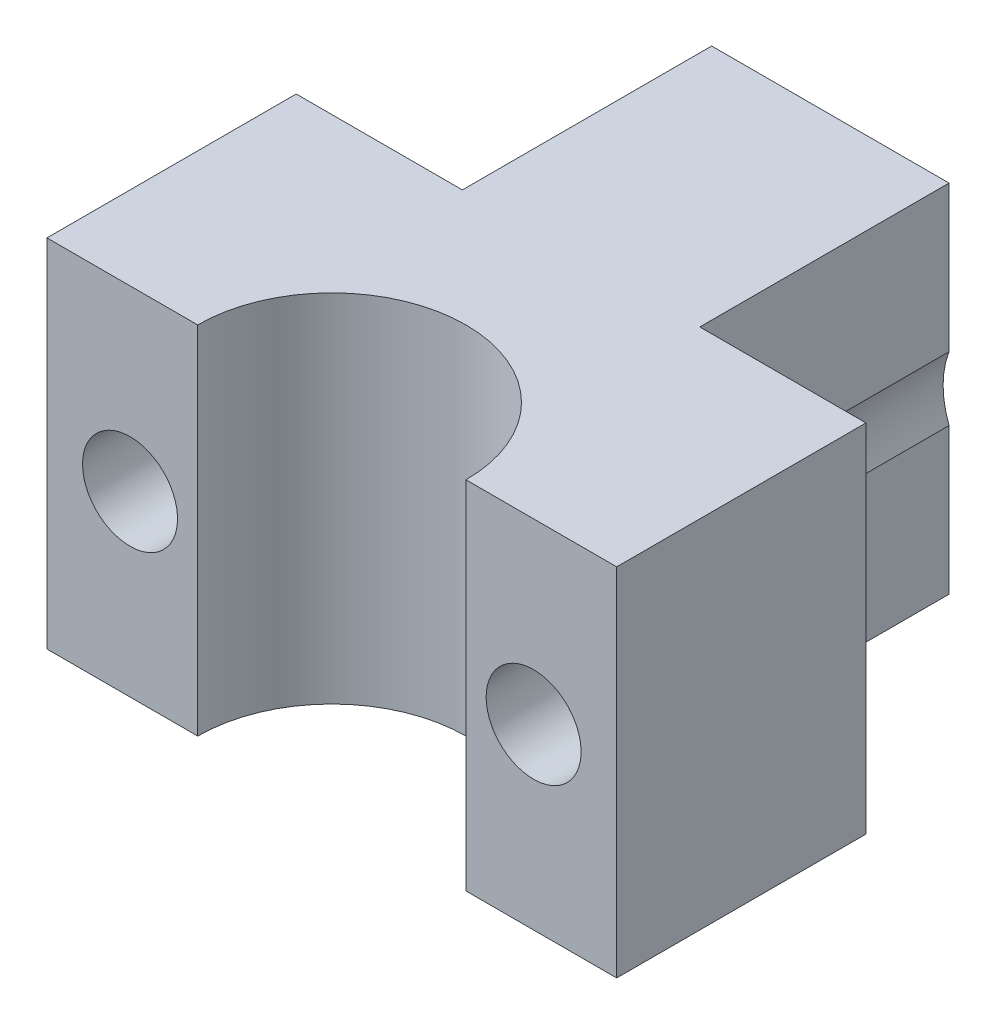
ISO-10303-21;
HEADER;
FILE_DESCRIPTION(('STEP AP214'),'2;1');
FILE_NAME('part.step','',(''),(''),'','','');
FILE_SCHEMA(('AUTOMOTIVE_DESIGN { 1 0 10303 214 1 1 1 1 }'));
ENDSEC;
DATA;
#1=APPLICATION_CONTEXT('core data for automotive mechanical design processes');
#2=APPLICATION_PROTOCOL_DEFINITION('international standard','automotive_design',2000,#1);
#3=PRODUCT_CONTEXT('',#1,'mechanical');
#4=PRODUCT('Part','Part','',(#3));
#5=PRODUCT_RELATED_PRODUCT_CATEGORY('part','',(#4));
#6=PRODUCT_DEFINITION_FORMATION('','',#4);
#7=PRODUCT_DEFINITION_CONTEXT('part definition',#1,'design');
#8=PRODUCT_DEFINITION('design','',#6,#7);
#9=PRODUCT_DEFINITION_SHAPE('','',#8);
#10=(LENGTH_UNIT() NAMED_UNIT(*) SI_UNIT(.MILLI.,.METRE.));
#11=(NAMED_UNIT(*) PLANE_ANGLE_UNIT() SI_UNIT($,.RADIAN.));
#12=(NAMED_UNIT(*) SI_UNIT($,.STERADIAN.) SOLID_ANGLE_UNIT());
#13=UNCERTAINTY_MEASURE_WITH_UNIT(LENGTH_MEASURE(1.E-05),#10,'distance_accuracy_value','');
#14=(GEOMETRIC_REPRESENTATION_CONTEXT(3) GLOBAL_UNCERTAINTY_ASSIGNED_CONTEXT((#13)) GLOBAL_UNIT_ASSIGNED_CONTEXT((#10,
#11,#12)) REPRESENTATION_CONTEXT('',''));
#15=CARTESIAN_POINT('',(0.,0.,0.));
#16=DIRECTION('',(0.,0.,1.));
#17=DIRECTION('',(1.,0.,0.));
#18=AXIS2_PLACEMENT_3D('',#15,#16,#17);
#19=CARTESIAN_POINT('',(-10.,0.,0.));
#20=DIRECTION('',(1.,0.,0.));
#21=DIRECTION('',(0.,0.,-1.));
#22=AXIS2_PLACEMENT_3D('',#19,#20,#21);
#23=PLANE('',#22);
#24=DIRECTION('',(0.,0.,1.));
#25=VECTOR('',#24,1.);
#26=CARTESIAN_POINT('',(-10.,17.6925824035673,-32.));
#27=LINE('',#26,#25);
#28=CARTESIAN_POINT('',(-10.,17.6925824035673,-11.));
#29=VERTEX_POINT('',#28);
#30=CARTESIAN_POINT('',(-10.,17.6925824035673,-16.4));
#31=VERTEX_POINT('',#30);
#32=EDGE_CURVE('E11',#29,#31,#27,.F.);
#33=ORIENTED_EDGE('',*,*,#32,.F.);
#34=DIRECTION('',(0.,1.,0.));
#35=VECTOR('',#34,1.);
#36=CARTESIAN_POINT('',(-10.,0.,-11.));
#37=LINE('',#36,#35);
#38=CARTESIAN_POINT('',(-10.,30.,-11.));
#39=VERTEX_POINT('',#38);
#40=EDGE_CURVE('E355',#29,#39,#37,.T.);
#41=ORIENTED_EDGE('',*,*,#40,.T.);
#42=DIRECTION('',(0.,0.,-1.));
#43=VECTOR('',#42,1.);
#44=CARTESIAN_POINT('',(-10.,30.,-11.));
#45=LINE('',#44,#43);
#46=CARTESIAN_POINT('',(-10.,30.,-32.));
#47=VERTEX_POINT('',#46);
#48=EDGE_CURVE('E246',#39,#47,#45,.T.);
#49=ORIENTED_EDGE('',*,*,#48,.T.);
#50=DIRECTION('',(0.,-1.,0.));
#51=VECTOR('',#50,1.);
#52=CARTESIAN_POINT('',(-10.,0.,-32.));
#53=LINE('',#52,#51);
#54=CARTESIAN_POINT('',(-10.,17.6925824035673,-32.));
#55=VERTEX_POINT('',#54);
#56=EDGE_CURVE('E238',#47,#55,#53,.T.);
#57=ORIENTED_EDGE('',*,*,#56,.T.);
#58=CARTESIAN_POINT('',(-10.,17.6925824035673,-26.6));
#59=VERTEX_POINT('',#58);
#60=EDGE_CURVE('E41',#59,#55,#27,.F.);
#61=ORIENTED_EDGE('',*,*,#60,.F.);
#62=DIRECTION('',(0.,-1.,0.));
#63=VECTOR('',#62,1.);
#64=CARTESIAN_POINT('',(-10.,4.9,-26.6));
#65=LINE('',#64,#63);
#66=CARTESIAN_POINT('',(-10.,25.1,-26.6));
#67=VERTEX_POINT('',#66);
#68=EDGE_CURVE('E343',#67,#59,#65,.T.);
#69=ORIENTED_EDGE('',*,*,#68,.F.);
#70=DIRECTION('',(0.,0.,-1.));
#71=VECTOR('',#70,1.);
#72=CARTESIAN_POINT('',(-10.,25.1,-16.4));
#73=LINE('',#72,#71);
#74=CARTESIAN_POINT('',(-10.,25.1,-16.4));
#75=VERTEX_POINT('',#74);
#76=EDGE_CURVE('E339',#75,#67,#73,.T.);
#77=ORIENTED_EDGE('',*,*,#76,.F.);
#78=DIRECTION('',(0.,1.,0.));
#79=VECTOR('',#78,1.);
#80=CARTESIAN_POINT('',(-10.,4.9,-16.4));
#81=LINE('',#80,#79);
#82=EDGE_CURVE('E335',#31,#75,#81,.T.);
#83=ORIENTED_EDGE('',*,*,#82,.F.);
#84=EDGE_LOOP('',(#33,#41,#49,#57,#61,#69,#77,#83));
#85=FACE_BOUND('',#84,.T.);
#86=ADVANCED_FACE('F37',(#85),#23,.F.);
#87=DIRECTION('',(0.,0.,1.));
#88=VECTOR('',#87,1.);
#89=CARTESIAN_POINT('',(-10.,12.3074175964327,-32.));
#90=LINE('',#89,#88);
#91=CARTESIAN_POINT('',(-10.,12.3074175964327,-32.));
#92=VERTEX_POINT('',#91);
#93=CARTESIAN_POINT('',(-10.,12.3074175964327,-26.6));
#94=VERTEX_POINT('',#93);
#95=EDGE_CURVE('E221',#92,#94,#90,.T.);
#96=ORIENTED_EDGE('',*,*,#95,.F.);
#97=CARTESIAN_POINT('',(-10.,0.,-32.));
#98=VERTEX_POINT('',#97);
#99=EDGE_CURVE('E241',#92,#98,#53,.T.);
#100=ORIENTED_EDGE('',*,*,#99,.T.);
#101=DIRECTION('',(0.,0.,1.));
#102=VECTOR('',#101,1.);
#103=CARTESIAN_POINT('',(-10.,0.,-11.));
#104=LINE('',#103,#102);
#105=CARTESIAN_POINT('',(-10.,0.,-11.));
#106=VERTEX_POINT('',#105);
#107=EDGE_CURVE('E256',#98,#106,#104,.T.);
#108=ORIENTED_EDGE('',*,*,#107,.T.);
#109=CARTESIAN_POINT('',(-10.,12.3074175964327,-11.));
#110=VERTEX_POINT('',#109);
#111=EDGE_CURVE('E356',#106,#110,#37,.T.);
#112=ORIENTED_EDGE('',*,*,#111,.T.);
#113=CARTESIAN_POINT('',(-10.,12.3074175964327,-16.4));
#114=VERTEX_POINT('',#113);
#115=EDGE_CURVE('E219',#114,#110,#90,.T.);
#116=ORIENTED_EDGE('',*,*,#115,.F.);
#117=CARTESIAN_POINT('',(-10.,4.9,-16.4));
#118=VERTEX_POINT('',#117);
#119=EDGE_CURVE('E336',#118,#114,#81,.T.);
#120=ORIENTED_EDGE('',*,*,#119,.F.);
#121=DIRECTION('',(0.,0.,1.));
#122=VECTOR('',#121,1.);
#123=CARTESIAN_POINT('',(-10.,4.9,-16.4));
#124=LINE('',#123,#122);
#125=CARTESIAN_POINT('',(-10.,4.9,-26.6));
#126=VERTEX_POINT('',#125);
#127=EDGE_CURVE('E330',#126,#118,#124,.T.);
#128=ORIENTED_EDGE('',*,*,#127,.F.);
#129=EDGE_CURVE('E342',#94,#126,#65,.T.);
#130=ORIENTED_EDGE('',*,*,#129,.F.);
#131=EDGE_LOOP('',(#96,#100,#108,#112,#116,#120,#128,#130));
#132=FACE_BOUND('',#131,.T.);
#133=ADVANCED_FACE('F382',(#132),#23,.F.);
#134=CARTESIAN_POINT('',(10.,0.,0.));
#135=DIRECTION('',(1.,0.,0.));
#136=DIRECTION('',(0.,0.,-1.));
#137=AXIS2_PLACEMENT_3D('',#134,#135,#136);
#138=PLANE('',#137);
#139=DIRECTION('',(0.,-1.,0.));
#140=VECTOR('',#139,1.);
#141=CARTESIAN_POINT('',(10.,0.,-11.));
#142=LINE('',#141,#140);
#143=CARTESIAN_POINT('',(10.,30.,-11.));
#144=VERTEX_POINT('',#143);
#145=CARTESIAN_POINT('',(10.,17.6925824035672,-11.));
#146=VERTEX_POINT('',#145);
#147=EDGE_CURVE('E271',#144,#146,#142,.T.);
#148=ORIENTED_EDGE('',*,*,#147,.T.);
#149=DIRECTION('',(0.,0.,1.));
#150=VECTOR('',#149,1.);
#151=CARTESIAN_POINT('',(10.,17.6925824035672,-32.));
#152=LINE('',#151,#150);
#153=CARTESIAN_POINT('',(10.,17.6925824035672,-32.));
#154=VERTEX_POINT('',#153);
#155=EDGE_CURVE('E217',#146,#154,#152,.F.);
#156=ORIENTED_EDGE('',*,*,#155,.T.);
#157=DIRECTION('',(0.,1.,0.));
#158=VECTOR('',#157,1.);
#159=CARTESIAN_POINT('',(10.,0.,-32.));
#160=LINE('',#159,#158);
#161=CARTESIAN_POINT('',(10.,30.,-32.));
#162=VERTEX_POINT('',#161);
#163=EDGE_CURVE('E264',#154,#162,#160,.T.);
#164=ORIENTED_EDGE('',*,*,#163,.T.);
#165=DIRECTION('',(0.,0.,1.));
#166=VECTOR('',#165,1.);
#167=CARTESIAN_POINT('',(10.,30.,-11.));
#168=LINE('',#167,#166);
#169=EDGE_CURVE('E268',#162,#144,#168,.T.);
#170=ORIENTED_EDGE('',*,*,#169,.T.);
#171=EDGE_LOOP('',(#148,#156,#164,#170));
#172=FACE_BOUND('',#171,.T.);
#173=ADVANCED_FACE('F367',(#172),#138,.T.);
#174=CARTESIAN_POINT('',(10.,0.,-32.));
#175=VERTEX_POINT('',#174);
#176=CARTESIAN_POINT('',(10.,12.3074175964328,-32.));
#177=VERTEX_POINT('',#176);
#178=EDGE_CURVE('E265',#175,#177,#160,.T.);
#179=ORIENTED_EDGE('',*,*,#178,.T.);
#180=DIRECTION('',(0.,0.,1.));
#181=VECTOR('',#180,1.);
#182=CARTESIAN_POINT('',(10.,12.3074175964328,-32.));
#183=LINE('',#182,#181);
#184=CARTESIAN_POINT('',(10.,12.3074175964328,-11.));
#185=VERTEX_POINT('',#184);
#186=EDGE_CURVE('E214',#177,#185,#183,.T.);
#187=ORIENTED_EDGE('',*,*,#186,.T.);
#188=CARTESIAN_POINT('',(10.,0.,-11.));
#189=VERTEX_POINT('',#188);
#190=EDGE_CURVE('E270',#185,#189,#142,.T.);
#191=ORIENTED_EDGE('',*,*,#190,.T.);
#192=DIRECTION('',(0.,0.,-1.));
#193=VECTOR('',#192,1.);
#194=CARTESIAN_POINT('',(10.,0.,-11.));
#195=LINE('',#194,#193);
#196=EDGE_CURVE('E261',#189,#175,#195,.T.);
#197=ORIENTED_EDGE('',*,*,#196,.T.);
#198=EDGE_LOOP('',(#179,#187,#191,#197));
#199=FACE_BOUND('',#198,.T.);
#200=ADVANCED_FACE('F299',(#199),#138,.T.);
#201=CARTESIAN_POINT('',(24.,4.9,-16.4));
#202=DIRECTION('',(0.,-1.,0.));
#203=DIRECTION('',(0.,0.,-1.));
#204=AXIS2_PLACEMENT_3D('',#201,#202,#203);
#205=PLANE('',#204);
#206=DIRECTION('',(0.,0.,-1.));
#207=VECTOR('',#206,1.);
#208=CARTESIAN_POINT('',(6.,4.9,-26.6));
#209=LINE('',#208,#207);
#210=CARTESIAN_POINT('',(6.,4.9,-16.4));
#211=VERTEX_POINT('',#210);
#212=CARTESIAN_POINT('',(6.,4.9,-26.6));
#213=VERTEX_POINT('',#212);
#214=EDGE_CURVE('E308',#211,#213,#209,.T.);
#215=ORIENTED_EDGE('',*,*,#214,.T.);
#216=DIRECTION('',(-1.,0.,0.));
#217=VECTOR('',#216,1.);
#218=CARTESIAN_POINT('',(24.,4.9,-26.6));
#219=LINE('',#218,#217);
#220=EDGE_CURVE('E257',#213,#126,#219,.T.);
#221=ORIENTED_EDGE('',*,*,#220,.T.);
#222=ORIENTED_EDGE('',*,*,#127,.T.);
#223=DIRECTION('',(-1.,0.,0.));
#224=VECTOR('',#223,1.);
#225=CARTESIAN_POINT('',(24.,4.9,-16.4));
#226=LINE('',#225,#224);
#227=EDGE_CURVE('E345',#211,#118,#226,.T.);
#228=ORIENTED_EDGE('',*,*,#227,.F.);
#229=EDGE_LOOP('',(#215,#221,#222,#228));
#230=FACE_BOUND('',#229,.T.);
#231=ADVANCED_FACE('F389',(#230),#205,.F.);
#232=CARTESIAN_POINT('',(24.,4.9,-26.6));
#233=DIRECTION('',(0.,0.,-1.));
#234=DIRECTION('',(-1.,0.,0.));
#235=AXIS2_PLACEMENT_3D('',#232,#233,#234);
#236=PLANE('',#235);
#237=CARTESIAN_POINT('',(-17.,15.,-26.6));
#238=DIRECTION('',(0.,0.,-1.));
#239=DIRECTION('',(-1.,0.,0.));
#240=AXIS2_PLACEMENT_3D('',#237,#238,#239);
#241=CIRCLE('',#240,7.5);
#242=EDGE_CURVE('E228',#94,#59,#241,.F.);
#243=ORIENTED_EDGE('',*,*,#242,.F.);
#244=ORIENTED_EDGE('',*,*,#129,.T.);
#245=ORIENTED_EDGE('',*,*,#220,.F.);
#246=DIRECTION('',(0.,1.,0.));
#247=VECTOR('',#246,1.);
#248=CARTESIAN_POINT('',(6.,4.9,-26.6));
#249=LINE('',#248,#247);
#250=CARTESIAN_POINT('',(6.,25.1,-26.6));
#251=VERTEX_POINT('',#250);
#252=EDGE_CURVE('E315',#213,#251,#249,.T.);
#253=ORIENTED_EDGE('',*,*,#252,.T.);
#254=DIRECTION('',(-1.,0.,0.));
#255=VECTOR('',#254,1.);
#256=CARTESIAN_POINT('',(24.,25.1,-26.6));
#257=LINE('',#256,#255);
#258=EDGE_CURVE('E348',#251,#67,#257,.T.);
#259=ORIENTED_EDGE('',*,*,#258,.T.);
#260=ORIENTED_EDGE('',*,*,#68,.T.);
#261=EDGE_LOOP('',(#243,#244,#245,#253,#259,#260));
#262=FACE_BOUND('',#261,.T.);
#263=ADVANCED_FACE('F432',(#262),#236,.F.);
#264=CARTESIAN_POINT('',(24.,25.1,-16.4));
#265=DIRECTION('',(0.,1.,0.));
#266=DIRECTION('',(0.,0.,1.));
#267=AXIS2_PLACEMENT_3D('',#264,#265,#266);
#268=PLANE('',#267);
#269=DIRECTION('',(0.,0.,1.));
#270=VECTOR('',#269,1.);
#271=CARTESIAN_POINT('',(6.,25.1,-26.6));
#272=LINE('',#271,#270);
#273=CARTESIAN_POINT('',(6.,25.1,-16.4));
#274=VERTEX_POINT('',#273);
#275=EDGE_CURVE('E317',#251,#274,#272,.T.);
#276=ORIENTED_EDGE('',*,*,#275,.T.);
#277=DIRECTION('',(-1.,0.,0.));
#278=VECTOR('',#277,1.);
#279=CARTESIAN_POINT('',(24.,25.1,-16.4));
#280=LINE('',#279,#278);
#281=EDGE_CURVE('E350',#274,#75,#280,.T.);
#282=ORIENTED_EDGE('',*,*,#281,.T.);
#283=ORIENTED_EDGE('',*,*,#76,.T.);
#284=ORIENTED_EDGE('',*,*,#258,.F.);
#285=EDGE_LOOP('',(#276,#282,#283,#284));
#286=FACE_BOUND('',#285,.T.);
#287=ADVANCED_FACE('F437',(#286),#268,.F.);
#288=CARTESIAN_POINT('',(24.,4.9,-16.4));
#289=DIRECTION('',(0.,0.,1.));
#290=DIRECTION('',(1.,0.,0.));
#291=AXIS2_PLACEMENT_3D('',#288,#289,#290);
#292=PLANE('',#291);
#293=CARTESIAN_POINT('',(-17.,15.,-16.4));
#294=DIRECTION('',(0.,0.,1.));
#295=DIRECTION('',(1.,0.,0.));
#296=AXIS2_PLACEMENT_3D('',#293,#294,#295);
#297=CIRCLE('',#296,7.5);
#298=EDGE_CURVE('E242',#31,#114,#297,.F.);
#299=ORIENTED_EDGE('',*,*,#298,.F.);
#300=ORIENTED_EDGE('',*,*,#82,.T.);
#301=ORIENTED_EDGE('',*,*,#281,.F.);
#302=DIRECTION('',(0.,-1.,0.));
#303=VECTOR('',#302,1.);
#304=CARTESIAN_POINT('',(6.,4.9,-16.4));
#305=LINE('',#304,#303);
#306=EDGE_CURVE('E305',#274,#211,#305,.T.);
#307=ORIENTED_EDGE('',*,*,#306,.T.);
#308=ORIENTED_EDGE('',*,*,#227,.T.);
#309=ORIENTED_EDGE('',*,*,#119,.T.);
#310=EDGE_LOOP('',(#299,#300,#301,#307,#308,#309));
#311=FACE_BOUND('',#310,.T.);
#312=ADVANCED_FACE('F400',(#311),#292,.F.);
#313=CARTESIAN_POINT('',(-24.,0.,-32.));
#314=DIRECTION('',(0.,0.,1.));
#315=DIRECTION('',(1.,0.,0.));
#316=AXIS2_PLACEMENT_3D('',#313,#314,#315);
#317=PLANE('',#316);
#318=CARTESIAN_POINT('',(-17.,15.,-32.));
#319=DIRECTION('',(0.,0.,-1.));
#320=DIRECTION('',(-1.,0.,0.));
#321=AXIS2_PLACEMENT_3D('',#318,#319,#320);
#322=CIRCLE('',#321,7.5);
#323=EDGE_CURVE('E60',#55,#92,#322,.T.);
#324=ORIENTED_EDGE('',*,*,#323,.F.);
#325=ORIENTED_EDGE('',*,*,#56,.F.);
#326=DIRECTION('',(1.,0.,0.));
#327=VECTOR('',#326,1.);
#328=CARTESIAN_POINT('',(-24.,30.,-32.));
#329=LINE('',#328,#327);
#330=EDGE_CURVE('E204',#47,#162,#329,.T.);
#331=ORIENTED_EDGE('',*,*,#330,.T.);
#332=ORIENTED_EDGE('',*,*,#163,.F.);
#333=CARTESIAN_POINT('',(17.,15.,-32.));
#334=DIRECTION('',(0.,0.,-1.));
#335=DIRECTION('',(-1.,0.,0.));
#336=AXIS2_PLACEMENT_3D('',#333,#334,#335);
#337=CIRCLE('',#336,7.5);
#338=EDGE_CURVE('E302',#177,#154,#337,.T.);
#339=ORIENTED_EDGE('',*,*,#338,.F.);
#340=ORIENTED_EDGE('',*,*,#178,.F.);
#341=DIRECTION('',(1.,0.,0.));
#342=VECTOR('',#341,1.);
#343=CARTESIAN_POINT('',(-24.,0.,-32.));
#344=LINE('',#343,#342);
#345=EDGE_CURVE('E279',#98,#175,#344,.T.);
#346=ORIENTED_EDGE('',*,*,#345,.F.);
#347=ORIENTED_EDGE('',*,*,#99,.F.);
#348=EDGE_LOOP('',(#324,#325,#331,#332,#339,#340,#346,#347));
#349=FACE_BOUND('',#348,.T.);
#350=ADVANCED_FACE('F236',(#349),#317,.F.);
#351=CARTESIAN_POINT('',(-24.,30.,10.));
#352=DIRECTION('',(0.,0.,-1.));
#353=DIRECTION('',(-1.,0.,0.));
#354=AXIS2_PLACEMENT_3D('',#351,#352,#353);
#355=PLANE('',#354);
#356=CARTESIAN_POINT('',(17.,15.,10.));
#357=DIRECTION('',(0.,0.,-1.));
#358=DIRECTION('',(-1.,0.,0.));
#359=AXIS2_PLACEMENT_3D('',#356,#357,#358);
#360=CIRCLE('',#359,4.);
#361=CARTESIAN_POINT('',(13.,15.,10.));
#362=VERTEX_POINT('',#361);
#363=EDGE_CURVE('E321',#362,#362,#360,.T.);
#364=ORIENTED_EDGE('',*,*,#363,.T.);
#365=EDGE_LOOP('',(#364));
#366=FACE_BOUND('',#365,.T.);
#367=DIRECTION('',(1.,0.,0.));
#368=VECTOR('',#367,1.);
#369=CARTESIAN_POINT('',(-24.,30.,10.));
#370=LINE('',#369,#368);
#371=CARTESIAN_POINT('',(11.3,30.,10.));
#372=VERTEX_POINT('',#371);
#373=CARTESIAN_POINT('',(24.,30.,10.));
#374=VERTEX_POINT('',#373);
#375=EDGE_CURVE('E185',#372,#374,#370,.T.);
#376=ORIENTED_EDGE('',*,*,#375,.F.);
#377=DIRECTION('',(0.,1.,0.));
#378=VECTOR('',#377,1.);
#379=CARTESIAN_POINT('',(11.3,0.,10.));
#380=LINE('',#379,#378);
#381=CARTESIAN_POINT('',(11.3,0.,10.));
#382=VERTEX_POINT('',#381);
#383=EDGE_CURVE('E171',#372,#382,#380,.F.);
#384=ORIENTED_EDGE('',*,*,#383,.T.);
#385=DIRECTION('',(1.,0.,0.));
#386=VECTOR('',#385,1.);
#387=CARTESIAN_POINT('',(-24.,0.,10.));
#388=LINE('',#387,#386);
#389=CARTESIAN_POINT('',(24.,0.,10.));
#390=VERTEX_POINT('',#389);
#391=EDGE_CURVE('E206',#382,#390,#388,.T.);
#392=ORIENTED_EDGE('',*,*,#391,.T.);
#393=DIRECTION('',(0.,-1.,0.));
#394=VECTOR('',#393,1.);
#395=CARTESIAN_POINT('',(24.,30.,10.));
#396=LINE('',#395,#394);
#397=EDGE_CURVE('E192',#374,#390,#396,.T.);
#398=ORIENTED_EDGE('',*,*,#397,.F.);
#399=EDGE_LOOP('',(#376,#384,#392,#398));
#400=FACE_BOUND('',#399,.T.);
#401=ADVANCED_FACE('F190',(#366,#400),#355,.F.);
#402=CARTESIAN_POINT('',(24.,30.,10.));
#403=DIRECTION('',(-1.,0.,0.));
#404=DIRECTION('',(0.,0.,1.));
#405=AXIS2_PLACEMENT_3D('',#402,#403,#404);
#406=PLANE('',#405);
#407=DIRECTION('',(0.,0.,-1.));
#408=VECTOR('',#407,1.);
#409=CARTESIAN_POINT('',(24.,0.,10.));
#410=LINE('',#409,#408);
#411=CARTESIAN_POINT('',(24.,0.,-11.));
#412=VERTEX_POINT('',#411);
#413=EDGE_CURVE('E200',#390,#412,#410,.T.);
#414=ORIENTED_EDGE('',*,*,#413,.T.);
#415=DIRECTION('',(0.,-1.,0.));
#416=VECTOR('',#415,1.);
#417=CARTESIAN_POINT('',(24.,0.,-11.));
#418=LINE('',#417,#416);
#419=CARTESIAN_POINT('',(24.,30.,-11.));
#420=VERTEX_POINT('',#419);
#421=EDGE_CURVE('E259',#420,#412,#418,.T.);
#422=ORIENTED_EDGE('',*,*,#421,.F.);
#423=DIRECTION('',(0.,0.,-1.));
#424=VECTOR('',#423,1.);
#425=CARTESIAN_POINT('',(24.,30.,10.));
#426=LINE('',#425,#424);
#427=EDGE_CURVE('E196',#374,#420,#426,.T.);
#428=ORIENTED_EDGE('',*,*,#427,.F.);
#429=ORIENTED_EDGE('',*,*,#397,.T.);
#430=EDGE_LOOP('',(#414,#422,#428,#429));
#431=FACE_BOUND('',#430,.T.);
#432=ADVANCED_FACE('F39',(#431),#406,.F.);
#433=CARTESIAN_POINT('',(-24.,30.,10.));
#434=DIRECTION('',(1.,0.,0.));
#435=DIRECTION('',(0.,0.,-1.));
#436=AXIS2_PLACEMENT_3D('',#433,#434,#435);
#437=PLANE('',#436);
#438=DIRECTION('',(0.,0.,1.));
#439=VECTOR('',#438,1.);
#440=CARTESIAN_POINT('',(-24.,30.,10.));
#441=LINE('',#440,#439);
#442=CARTESIAN_POINT('',(-24.,30.,-11.));
#443=VERTEX_POINT('',#442);
#444=CARTESIAN_POINT('',(-24.,30.,10.));
#445=VERTEX_POINT('',#444);
#446=EDGE_CURVE('E194',#443,#445,#441,.T.);
#447=ORIENTED_EDGE('',*,*,#446,.F.);
#448=DIRECTION('',(0.,1.,0.));
#449=VECTOR('',#448,1.);
#450=CARTESIAN_POINT('',(-24.,0.,-11.));
#451=LINE('',#450,#449);
#452=CARTESIAN_POINT('',(-24.,0.,-11.));
#453=VERTEX_POINT('',#452);
#454=EDGE_CURVE('E254',#453,#443,#451,.T.);
#455=ORIENTED_EDGE('',*,*,#454,.F.);
#456=DIRECTION('',(0.,0.,1.));
#457=VECTOR('',#456,1.);
#458=CARTESIAN_POINT('',(-24.,0.,10.));
#459=LINE('',#458,#457);
#460=CARTESIAN_POINT('',(-24.,0.,10.));
#461=VERTEX_POINT('',#460);
#462=EDGE_CURVE('E203',#453,#461,#459,.T.);
#463=ORIENTED_EDGE('',*,*,#462,.T.);
#464=DIRECTION('',(0.,-1.,0.));
#465=VECTOR('',#464,1.);
#466=CARTESIAN_POINT('',(-24.,30.,10.));
#467=LINE('',#466,#465);
#468=EDGE_CURVE('E211',#445,#461,#467,.T.);
#469=ORIENTED_EDGE('',*,*,#468,.F.);
#470=EDGE_LOOP('',(#447,#455,#463,#469));
#471=FACE_BOUND('',#470,.T.);
#472=ADVANCED_FACE('F407',(#471),#437,.F.);
#473=CARTESIAN_POINT('',(-17.,15.,10.));
#474=DIRECTION('',(0.,0.,-1.));
#475=DIRECTION('',(-1.,0.,0.));
#476=AXIS2_PLACEMENT_3D('',#473,#474,#475);
#477=CIRCLE('',#476,4.);
#478=CARTESIAN_POINT('',(-21.,15.,10.));
#479=VERTEX_POINT('',#478);
#480=EDGE_CURVE('E327',#479,#479,#477,.T.);
#481=ORIENTED_EDGE('',*,*,#480,.T.);
#482=EDGE_LOOP('',(#481));
#483=FACE_BOUND('',#482,.T.);
#484=CARTESIAN_POINT('',(-11.3,0.,10.));
#485=VERTEX_POINT('',#484);
#486=EDGE_CURVE('E207',#461,#485,#388,.T.);
#487=ORIENTED_EDGE('',*,*,#486,.T.);
#488=DIRECTION('',(0.,1.,0.));
#489=VECTOR('',#488,1.);
#490=CARTESIAN_POINT('',(-11.3,0.,10.));
#491=LINE('',#490,#489);
#492=CARTESIAN_POINT('',(-11.3,30.,10.));
#493=VERTEX_POINT('',#492);
#494=EDGE_CURVE('E52',#485,#493,#491,.T.);
#495=ORIENTED_EDGE('',*,*,#494,.T.);
#496=EDGE_CURVE('E188',#445,#493,#370,.T.);
#497=ORIENTED_EDGE('',*,*,#496,.F.);
#498=ORIENTED_EDGE('',*,*,#468,.T.);
#499=EDGE_LOOP('',(#487,#495,#497,#498));
#500=FACE_BOUND('',#499,.T.);
#501=ADVANCED_FACE('F403',(#483,#500),#355,.F.);
#502=CARTESIAN_POINT('',(0.,30.,0.));
#503=DIRECTION('',(0.,-1.,0.));
#504=DIRECTION('',(0.,0.,-1.));
#505=AXIS2_PLACEMENT_3D('',#502,#503,#504);
#506=PLANE('',#505);
#507=ORIENTED_EDGE('',*,*,#496,.T.);
#508=CARTESIAN_POINT('',(0.,30.,10.));
#509=DIRECTION('',(0.,1.,0.));
#510=DIRECTION('',(0.,0.,1.));
#511=AXIS2_PLACEMENT_3D('',#508,#509,#510);
#512=CIRCLE('',#511,11.3);
#513=EDGE_CURVE('E174',#372,#493,#512,.T.);
#514=ORIENTED_EDGE('',*,*,#513,.F.);
#515=ORIENTED_EDGE('',*,*,#375,.T.);
#516=ORIENTED_EDGE('',*,*,#427,.T.);
#517=DIRECTION('',(1.,0.,0.));
#518=VECTOR('',#517,1.);
#519=CARTESIAN_POINT('',(10.,30.,-11.));
#520=LINE('',#519,#518);
#521=EDGE_CURVE('E274',#144,#420,#520,.T.);
#522=ORIENTED_EDGE('',*,*,#521,.F.);
#523=ORIENTED_EDGE('',*,*,#169,.F.);
#524=ORIENTED_EDGE('',*,*,#330,.F.);
#525=ORIENTED_EDGE('',*,*,#48,.F.);
#526=DIRECTION('',(-1.,0.,0.));
#527=VECTOR('',#526,1.);
#528=CARTESIAN_POINT('',(-10.,30.,-11.));
#529=LINE('',#528,#527);
#530=EDGE_CURVE('E249',#39,#443,#529,.T.);
#531=ORIENTED_EDGE('',*,*,#530,.T.);
#532=ORIENTED_EDGE('',*,*,#446,.T.);
#533=EDGE_LOOP('',(#507,#514,#515,#516,#522,#523,#524,#525,#531,#532));
#534=FACE_BOUND('',#533,.T.);
#535=ADVANCED_FACE('F183',(#534),#506,.F.);
#536=CARTESIAN_POINT('',(0.,0.,0.));
#537=DIRECTION('',(0.,-1.,0.));
#538=DIRECTION('',(0.,0.,-1.));
#539=AXIS2_PLACEMENT_3D('',#536,#537,#538);
#540=PLANE('',#539);
#541=CARTESIAN_POINT('',(0.,0.,10.));
#542=DIRECTION('',(0.,1.,0.));
#543=DIRECTION('',(0.,0.,1.));
#544=AXIS2_PLACEMENT_3D('',#541,#542,#543);
#545=CIRCLE('',#544,11.3);
#546=EDGE_CURVE('E175',#382,#485,#545,.T.);
#547=ORIENTED_EDGE('',*,*,#546,.T.);
#548=ORIENTED_EDGE('',*,*,#486,.F.);
#549=ORIENTED_EDGE('',*,*,#462,.F.);
#550=DIRECTION('',(-1.,0.,0.));
#551=VECTOR('',#550,1.);
#552=CARTESIAN_POINT('',(-10.,0.,-11.));
#553=LINE('',#552,#551);
#554=EDGE_CURVE('E247',#106,#453,#553,.T.);
#555=ORIENTED_EDGE('',*,*,#554,.F.);
#556=ORIENTED_EDGE('',*,*,#107,.F.);
#557=ORIENTED_EDGE('',*,*,#345,.T.);
#558=ORIENTED_EDGE('',*,*,#196,.F.);
#559=DIRECTION('',(1.,0.,0.));
#560=VECTOR('',#559,1.);
#561=CARTESIAN_POINT('',(10.,0.,-11.));
#562=LINE('',#561,#560);
#563=EDGE_CURVE('E276',#189,#412,#562,.T.);
#564=ORIENTED_EDGE('',*,*,#563,.T.);
#565=ORIENTED_EDGE('',*,*,#413,.F.);
#566=ORIENTED_EDGE('',*,*,#391,.F.);
#567=EDGE_LOOP('',(#547,#548,#549,#555,#556,#557,#558,#564,#565,#566));
#568=FACE_BOUND('',#567,.T.);
#569=ADVANCED_FACE('F295',(#568),#540,.T.);
#570=CARTESIAN_POINT('',(10.,0.,-11.));
#571=DIRECTION('',(0.,0.,1.));
#572=DIRECTION('',(0.,-1.,0.));
#573=AXIS2_PLACEMENT_3D('',#570,#571,#572);
#574=PLANE('',#573);
#575=ORIENTED_EDGE('',*,*,#190,.F.);
#576=CARTESIAN_POINT('',(17.,15.,-11.));
#577=DIRECTION('',(0.,0.,-1.));
#578=DIRECTION('',(-1.,0.,0.));
#579=AXIS2_PLACEMENT_3D('',#576,#577,#578);
#580=CIRCLE('',#579,7.5);
#581=EDGE_CURVE('E306',#185,#146,#580,.T.);
#582=ORIENTED_EDGE('',*,*,#581,.T.);
#583=ORIENTED_EDGE('',*,*,#147,.F.);
#584=ORIENTED_EDGE('',*,*,#521,.T.);
#585=ORIENTED_EDGE('',*,*,#421,.T.);
#586=ORIENTED_EDGE('',*,*,#563,.F.);
#587=EDGE_LOOP('',(#575,#582,#583,#584,#585,#586));
#588=FACE_BOUND('',#587,.T.);
#589=CARTESIAN_POINT('',(17.,15.,-11.));
#590=DIRECTION('',(0.,0.,-1.));
#591=DIRECTION('',(-1.,0.,0.));
#592=AXIS2_PLACEMENT_3D('',#589,#590,#591);
#593=CIRCLE('',#592,4.);
#594=CARTESIAN_POINT('',(13.,15.,-11.));
#595=VERTEX_POINT('',#594);
#596=EDGE_CURVE('E320',#595,#595,#593,.T.);
#597=ORIENTED_EDGE('',*,*,#596,.F.);
#598=EDGE_LOOP('',(#597));
#599=FACE_BOUND('',#598,.T.);
#600=ADVANCED_FACE('F290',(#588,#599),#574,.F.);
#601=CARTESIAN_POINT('',(-10.,0.,-11.));
#602=DIRECTION('',(0.,0.,1.));
#603=DIRECTION('',(0.,-1.,0.));
#604=AXIS2_PLACEMENT_3D('',#601,#602,#603);
#605=PLANE('',#604);
#606=ORIENTED_EDGE('',*,*,#454,.T.);
#607=ORIENTED_EDGE('',*,*,#530,.F.);
#608=ORIENTED_EDGE('',*,*,#40,.F.);
#609=CARTESIAN_POINT('',(-17.,15.,-11.));
#610=DIRECTION('',(0.,0.,-1.));
#611=DIRECTION('',(-1.,0.,0.));
#612=AXIS2_PLACEMENT_3D('',#609,#610,#611);
#613=CIRCLE('',#612,7.5);
#614=EDGE_CURVE('E179',#29,#110,#613,.T.);
#615=ORIENTED_EDGE('',*,*,#614,.T.);
#616=ORIENTED_EDGE('',*,*,#111,.F.);
#617=ORIENTED_EDGE('',*,*,#554,.T.);
#618=EDGE_LOOP('',(#606,#607,#608,#615,#616,#617));
#619=FACE_BOUND('',#618,.T.);
#620=CARTESIAN_POINT('',(-17.,15.,-11.));
#621=DIRECTION('',(0.,0.,-1.));
#622=DIRECTION('',(-1.,0.,0.));
#623=AXIS2_PLACEMENT_3D('',#620,#621,#622);
#624=CIRCLE('',#623,4.);
#625=CARTESIAN_POINT('',(-21.,15.,-11.));
#626=VERTEX_POINT('',#625);
#627=EDGE_CURVE('E324',#626,#626,#624,.T.);
#628=ORIENTED_EDGE('',*,*,#627,.F.);
#629=EDGE_LOOP('',(#628));
#630=FACE_BOUND('',#629,.T.);
#631=ADVANCED_FACE('F362',(#619,#630),#605,.F.);
#632=CARTESIAN_POINT('',(-17.,15.,10.));
#633=DIRECTION('',(0.,0.,-1.));
#634=DIRECTION('',(-1.,0.,0.));
#635=AXIS2_PLACEMENT_3D('',#632,#633,#634);
#636=CYLINDRICAL_SURFACE('',#635,4.);
#637=ORIENTED_EDGE('',*,*,#480,.F.);
#638=EDGE_LOOP('',(#637));
#639=FACE_BOUND('',#638,.T.);
#640=ORIENTED_EDGE('',*,*,#627,.T.);
#641=EDGE_LOOP('',(#640));
#642=FACE_BOUND('',#641,.T.);
#643=ADVANCED_FACE('F393',(#639,#642),#636,.F.);
#644=CARTESIAN_POINT('',(17.,15.,10.));
#645=DIRECTION('',(0.,0.,-1.));
#646=DIRECTION('',(-1.,0.,0.));
#647=AXIS2_PLACEMENT_3D('',#644,#645,#646);
#648=CYLINDRICAL_SURFACE('',#647,4.);
#649=ORIENTED_EDGE('',*,*,#363,.F.);
#650=EDGE_LOOP('',(#649));
#651=FACE_BOUND('',#650,.T.);
#652=ORIENTED_EDGE('',*,*,#596,.T.);
#653=EDGE_LOOP('',(#652));
#654=FACE_BOUND('',#653,.T.);
#655=ADVANCED_FACE('F378',(#651,#654),#648,.F.);
#656=CARTESIAN_POINT('',(6.,0.,0.));
#657=DIRECTION('',(1.,0.,0.));
#658=DIRECTION('',(0.,0.,-1.));
#659=AXIS2_PLACEMENT_3D('',#656,#657,#658);
#660=PLANE('',#659);
#661=ORIENTED_EDGE('',*,*,#306,.F.);
#662=ORIENTED_EDGE('',*,*,#275,.F.);
#663=ORIENTED_EDGE('',*,*,#252,.F.);
#664=ORIENTED_EDGE('',*,*,#214,.F.);
#665=EDGE_LOOP('',(#661,#662,#663,#664));
#666=FACE_BOUND('',#665,.T.);
#667=ADVANCED_FACE('F371',(#666),#660,.F.);
#668=CARTESIAN_POINT('',(17.,15.,-32.));
#669=DIRECTION('',(0.,0.,1.));
#670=DIRECTION('',(1.,0.,0.));
#671=AXIS2_PLACEMENT_3D('',#668,#669,#670);
#672=CYLINDRICAL_SURFACE('',#671,7.5);
#673=ORIENTED_EDGE('',*,*,#581,.F.);
#674=ORIENTED_EDGE('',*,*,#186,.F.);
#675=ORIENTED_EDGE('',*,*,#338,.T.);
#676=ORIENTED_EDGE('',*,*,#155,.F.);
#677=EDGE_LOOP('',(#673,#674,#675,#676));
#678=FACE_BOUND('',#677,.T.);
#679=ADVANCED_FACE('F368',(#678),#672,.F.);
#680=CARTESIAN_POINT('',(-17.,15.,-32.));
#681=DIRECTION('',(0.,0.,1.));
#682=DIRECTION('',(1.,0.,0.));
#683=AXIS2_PLACEMENT_3D('',#680,#681,#682);
#684=CYLINDRICAL_SURFACE('',#683,7.5);
#685=ORIENTED_EDGE('',*,*,#32,.T.);
#686=ORIENTED_EDGE('',*,*,#298,.T.);
#687=ORIENTED_EDGE('',*,*,#115,.T.);
#688=ORIENTED_EDGE('',*,*,#614,.F.);
#689=EDGE_LOOP('',(#685,#686,#687,#688));
#690=FACE_BOUND('',#689,.T.);
#691=ADVANCED_FACE('F370',(#690),#684,.F.);
#692=ORIENTED_EDGE('',*,*,#60,.T.);
#693=ORIENTED_EDGE('',*,*,#323,.T.);
#694=ORIENTED_EDGE('',*,*,#95,.T.);
#695=ORIENTED_EDGE('',*,*,#242,.T.);
#696=EDGE_LOOP('',(#692,#693,#694,#695));
#697=FACE_BOUND('',#696,.T.);
#698=ADVANCED_FACE('F227',(#697),#684,.F.);
#699=CARTESIAN_POINT('',(0.,0.,10.));
#700=DIRECTION('',(0.,1.,0.));
#701=DIRECTION('',(0.,0.,1.));
#702=AXIS2_PLACEMENT_3D('',#699,#700,#701);
#703=CYLINDRICAL_SURFACE('',#702,11.3);
#704=ORIENTED_EDGE('',*,*,#513,.T.);
#705=ORIENTED_EDGE('',*,*,#494,.F.);
#706=ORIENTED_EDGE('',*,*,#546,.F.);
#707=ORIENTED_EDGE('',*,*,#383,.F.);
#708=EDGE_LOOP('',(#704,#705,#706,#707));
#709=FACE_BOUND('',#708,.T.);
#710=ADVANCED_FACE('F173',(#709),#703,.F.);
#711=CLOSED_SHELL('',(#86,#133,#173,#200,#231,#263,#287,#312,#350,#401,#432,#472,#501,#535,#569,
#600,#631,#643,#655,#667,#679,#691,#698,#710));
#712=MANIFOLD_SOLID_BREP('B2',#711);
#713=ADVANCED_BREP_SHAPE_REPRESENTATION('',(#18,#712),#14);
#714=SHAPE_DEFINITION_REPRESENTATION(#9,#713);
ENDSEC;
END-ISO-10303-21;
